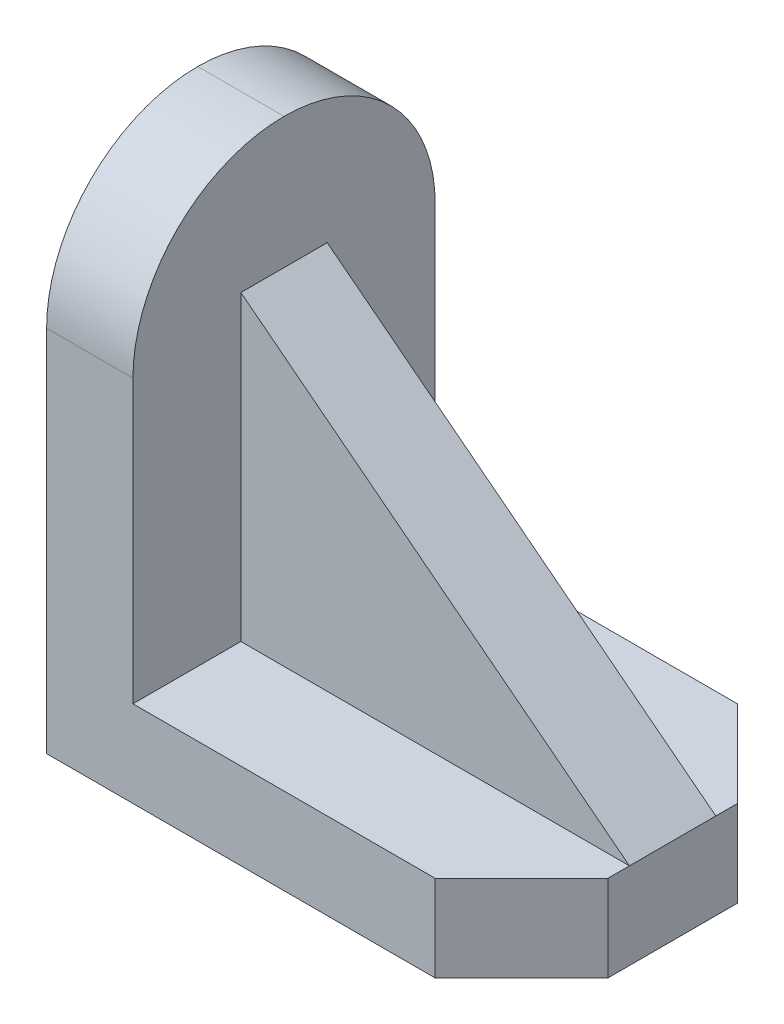
ISO-10303-21;
HEADER;
FILE_DESCRIPTION(('STEP AP214'),'2;1');
FILE_NAME('part.step','',(''),(''),'','','');
FILE_SCHEMA(('AUTOMOTIVE_DESIGN { 1 0 10303 214 1 1 1 1 }'));
ENDSEC;
DATA;
#1=APPLICATION_CONTEXT('core data for automotive mechanical design processes');
#2=APPLICATION_PROTOCOL_DEFINITION('international standard','automotive_design',2000,#1);
#3=PRODUCT_CONTEXT('',#1,'mechanical');
#4=PRODUCT('Part','Part','',(#3));
#5=PRODUCT_RELATED_PRODUCT_CATEGORY('part','',(#4));
#6=PRODUCT_DEFINITION_FORMATION('','',#4);
#7=PRODUCT_DEFINITION_CONTEXT('part definition',#1,'design');
#8=PRODUCT_DEFINITION('design','',#6,#7);
#9=PRODUCT_DEFINITION_SHAPE('','',#8);
#10=(LENGTH_UNIT() NAMED_UNIT(*) SI_UNIT(.MILLI.,.METRE.));
#11=(NAMED_UNIT(*) PLANE_ANGLE_UNIT() SI_UNIT($,.RADIAN.));
#12=(NAMED_UNIT(*) SI_UNIT($,.STERADIAN.) SOLID_ANGLE_UNIT());
#13=UNCERTAINTY_MEASURE_WITH_UNIT(LENGTH_MEASURE(1.E-05),#10,'distance_accuracy_value','');
#14=(GEOMETRIC_REPRESENTATION_CONTEXT(3) GLOBAL_UNCERTAINTY_ASSIGNED_CONTEXT((#13)) GLOBAL_UNIT_ASSIGNED_CONTEXT((#10,
#11,#12)) REPRESENTATION_CONTEXT('',''));
#15=CARTESIAN_POINT('',(0.,0.,0.));
#16=DIRECTION('',(0.,0.,1.));
#17=DIRECTION('',(1.,0.,0.));
#18=AXIS2_PLACEMENT_3D('',#15,#16,#17);
#19=CARTESIAN_POINT('',(0.,304.8,0.));
#20=DIRECTION('',(0.,1.,0.));
#21=DIRECTION('',(0.,0.,1.));
#22=AXIS2_PLACEMENT_3D('',#19,#20,#21);
#23=PLANE('',#22);
#24=DIRECTION('',(0.,0.,-1.));
#25=VECTOR('',#24,1.);
#26=CARTESIAN_POINT('',(-533.4,304.8,-533.4));
#27=LINE('',#26,#25);
#28=CARTESIAN_POINT('',(-533.4,304.8,-152.4));
#29=VERTEX_POINT('',#28);
#30=CARTESIAN_POINT('',(-533.4,304.8,-533.4));
#31=VERTEX_POINT('',#30);
#32=EDGE_CURVE('E164',#29,#31,#27,.T.);
#33=ORIENTED_EDGE('',*,*,#32,.F.);
#34=DIRECTION('',(-1.,0.,0.));
#35=VECTOR('',#34,1.);
#36=CARTESIAN_POINT('',(838.2,304.8,-152.4));
#37=LINE('',#36,#35);
#38=CARTESIAN_POINT('',(838.2,304.8,-152.4));
#39=VERTEX_POINT('',#38);
#40=EDGE_CURVE('E56',#39,#29,#37,.T.);
#41=ORIENTED_EDGE('',*,*,#40,.F.);
#42=DIRECTION('',(0.,0.,-1.));
#43=VECTOR('',#42,1.);
#44=CARTESIAN_POINT('',(838.2,304.8,228.6));
#45=LINE('',#44,#43);
#46=CARTESIAN_POINT('',(838.2,304.8,-228.599999999999));
#47=VERTEX_POINT('',#46);
#48=EDGE_CURVE('E179',#39,#47,#45,.T.);
#49=ORIENTED_EDGE('',*,*,#48,.T.);
#50=DIRECTION('',(0.707106781186546,0.,0.707106781186549));
#51=VECTOR('',#50,1.);
#52=CARTESIAN_POINT('',(533.400000000001,304.8,-533.399999999999));
#53=LINE('',#52,#51);
#54=CARTESIAN_POINT('',(533.4,304.8,-533.4));
#55=VERTEX_POINT('',#54);
#56=EDGE_CURVE('E228',#47,#55,#53,.F.);
#57=ORIENTED_EDGE('',*,*,#56,.T.);
#58=DIRECTION('',(-1.,0.,0.));
#59=VECTOR('',#58,1.);
#60=CARTESIAN_POINT('',(838.2,304.8,-533.4));
#61=LINE('',#60,#59);
#62=EDGE_CURVE('E183',#55,#31,#61,.T.);
#63=ORIENTED_EDGE('',*,*,#62,.T.);
#64=EDGE_LOOP('',(#33,#41,#49,#57,#63));
#65=FACE_BOUND('',#64,.T.);
#66=ADVANCED_FACE('F39',(#65),#23,.T.);
#67=CARTESIAN_POINT('',(-838.2,304.8,533.4));
#68=DIRECTION('',(1.,0.,0.));
#69=DIRECTION('',(0.,0.,-1.));
#70=AXIS2_PLACEMENT_3D('',#67,#68,#69);
#71=PLANE('',#70);
#72=CARTESIAN_POINT('',(-838.2,1300.48,1.35693925231964E-13));
#73=DIRECTION('',(1.,0.,0.));
#74=DIRECTION('',(0.,0.,-1.));
#75=AXIS2_PLACEMENT_3D('',#72,#73,#74);
#76=CIRCLE('',#75,533.4);
#77=CARTESIAN_POINT('',(-838.2,1300.48,533.4));
#78=VERTEX_POINT('',#77);
#79=CARTESIAN_POINT('',(-838.2,1833.88,1.11022302462516E-13));
#80=VERTEX_POINT('',#79);
#81=EDGE_CURVE('E231',#78,#80,#76,.F.);
#82=ORIENTED_EDGE('',*,*,#81,.T.);
#83=CARTESIAN_POINT('',(-838.2,1300.48,1.11022302462516E-13));
#84=DIRECTION('',(1.,0.,0.));
#85=DIRECTION('',(0.,0.,-1.));
#86=AXIS2_PLACEMENT_3D('',#83,#84,#85);
#87=CIRCLE('',#86,533.4);
#88=CARTESIAN_POINT('',(-838.2,1300.48,-533.4));
#89=VERTEX_POINT('',#88);
#90=EDGE_CURVE('E234',#80,#89,#87,.F.);
#91=ORIENTED_EDGE('',*,*,#90,.T.);
#92=DIRECTION('',(0.,-1.,0.));
#93=VECTOR('',#92,1.);
#94=CARTESIAN_POINT('',(-838.2,304.8,-533.4));
#95=LINE('',#94,#93);
#96=CARTESIAN_POINT('',(-838.2,0.,-533.4));
#97=VERTEX_POINT('',#96);
#98=EDGE_CURVE('E187',#89,#97,#95,.T.);
#99=ORIENTED_EDGE('',*,*,#98,.T.);
#100=DIRECTION('',(0.,0.,1.));
#101=VECTOR('',#100,1.);
#102=CARTESIAN_POINT('',(-838.2,0.,533.4));
#103=LINE('',#102,#101);
#104=CARTESIAN_POINT('',(-838.2,0.,533.4));
#105=VERTEX_POINT('',#104);
#106=EDGE_CURVE('E171',#97,#105,#103,.T.);
#107=ORIENTED_EDGE('',*,*,#106,.T.);
#108=DIRECTION('',(0.,-1.,0.));
#109=VECTOR('',#108,1.);
#110=CARTESIAN_POINT('',(-838.2,304.8,533.4));
#111=LINE('',#110,#109);
#112=EDGE_CURVE('E214',#78,#105,#111,.T.);
#113=ORIENTED_EDGE('',*,*,#112,.F.);
#114=EDGE_LOOP('',(#82,#91,#99,#107,#113));
#115=FACE_BOUND('',#114,.T.);
#116=ADVANCED_FACE('F277',(#115),#71,.F.);
#117=CARTESIAN_POINT('',(533.4,304.8,533.4));
#118=DIRECTION('',(0.,0.,-1.));
#119=DIRECTION('',(-1.,0.,0.));
#120=AXIS2_PLACEMENT_3D('',#117,#118,#119);
#121=PLANE('',#120);
#122=DIRECTION('',(0.,-1.,0.));
#123=VECTOR('',#122,1.);
#124=CARTESIAN_POINT('',(-533.4,1833.88,533.4));
#125=LINE('',#124,#123);
#126=CARTESIAN_POINT('',(-533.4,1300.48,533.4));
#127=VERTEX_POINT('',#126);
#128=CARTESIAN_POINT('',(-533.4,304.8,533.4));
#129=VERTEX_POINT('',#128);
#130=EDGE_CURVE('E168',#127,#129,#125,.T.);
#131=ORIENTED_EDGE('',*,*,#130,.F.);
#132=DIRECTION('',(1.,0.,0.));
#133=VECTOR('',#132,1.);
#134=CARTESIAN_POINT('',(-838.2,1300.48,533.4));
#135=LINE('',#134,#133);
#136=EDGE_CURVE('E11',#127,#78,#135,.F.);
#137=ORIENTED_EDGE('',*,*,#136,.T.);
#138=ORIENTED_EDGE('',*,*,#112,.T.);
#139=DIRECTION('',(1.,0.,0.));
#140=VECTOR('',#139,1.);
#141=CARTESIAN_POINT('',(533.4,0.,533.4));
#142=LINE('',#141,#140);
#143=CARTESIAN_POINT('',(533.4,0.,533.4));
#144=VERTEX_POINT('',#143);
#145=EDGE_CURVE('E191',#105,#144,#142,.T.);
#146=ORIENTED_EDGE('',*,*,#145,.T.);
#147=DIRECTION('',(0.,-1.,0.));
#148=VECTOR('',#147,1.);
#149=CARTESIAN_POINT('',(533.4,304.8,533.4));
#150=LINE('',#149,#148);
#151=CARTESIAN_POINT('',(533.4,304.8,533.4));
#152=VERTEX_POINT('',#151);
#153=EDGE_CURVE('E210',#152,#144,#150,.T.);
#154=ORIENTED_EDGE('',*,*,#153,.F.);
#155=DIRECTION('',(1.,0.,0.));
#156=VECTOR('',#155,1.);
#157=CARTESIAN_POINT('',(533.4,304.8,533.4));
#158=LINE('',#157,#156);
#159=EDGE_CURVE('E172',#129,#152,#158,.T.);
#160=ORIENTED_EDGE('',*,*,#159,.F.);
#161=EDGE_LOOP('',(#131,#137,#138,#146,#154,#160));
#162=FACE_BOUND('',#161,.T.);
#163=ADVANCED_FACE('F279',(#162),#121,.F.);
#164=CARTESIAN_POINT('',(838.2,304.8,228.6));
#165=DIRECTION('',(-0.707106781186548,0.,-0.707106781186547));
#166=DIRECTION('',(-0.707106781186547,0.,0.707106781186548));
#167=AXIS2_PLACEMENT_3D('',#164,#165,#166);
#168=PLANE('',#167);
#169=DIRECTION('',(0.707106781186547,0.,-0.707106781186547));
#170=VECTOR('',#169,1.);
#171=CARTESIAN_POINT('',(838.2,0.,228.6));
#172=LINE('',#171,#170);
#173=CARTESIAN_POINT('',(838.2,0.,228.6));
#174=VERTEX_POINT('',#173);
#175=EDGE_CURVE('E194',#144,#174,#172,.T.);
#176=ORIENTED_EDGE('',*,*,#175,.T.);
#177=DIRECTION('',(0.,-1.,0.));
#178=VECTOR('',#177,1.);
#179=CARTESIAN_POINT('',(838.2,304.8,228.6));
#180=LINE('',#179,#178);
#181=CARTESIAN_POINT('',(838.2,304.8,228.6));
#182=VERTEX_POINT('',#181);
#183=EDGE_CURVE('E206',#182,#174,#180,.T.);
#184=ORIENTED_EDGE('',*,*,#183,.F.);
#185=DIRECTION('',(0.707106781186547,0.,-0.707106781186547));
#186=VECTOR('',#185,1.);
#187=CARTESIAN_POINT('',(838.2,304.8,228.6));
#188=LINE('',#187,#186);
#189=EDGE_CURVE('E175',#152,#182,#188,.T.);
#190=ORIENTED_EDGE('',*,*,#189,.F.);
#191=ORIENTED_EDGE('',*,*,#153,.T.);
#192=EDGE_LOOP('',(#176,#184,#190,#191));
#193=FACE_BOUND('',#192,.T.);
#194=ADVANCED_FACE('F319',(#193),#168,.F.);
#195=CARTESIAN_POINT('',(838.2,304.8,228.6));
#196=DIRECTION('',(-1.,0.,0.));
#197=DIRECTION('',(0.,0.,1.));
#198=AXIS2_PLACEMENT_3D('',#195,#196,#197);
#199=PLANE('',#198);
#200=DIRECTION('',(0.,0.,-1.));
#201=VECTOR('',#200,1.);
#202=CARTESIAN_POINT('',(838.2,0.,228.6));
#203=LINE('',#202,#201);
#204=CARTESIAN_POINT('',(838.2,0.,-228.599999999999));
#205=VERTEX_POINT('',#204);
#206=EDGE_CURVE('E197',#174,#205,#203,.T.);
#207=ORIENTED_EDGE('',*,*,#206,.T.);
#208=DIRECTION('',(0.,1.,0.));
#209=VECTOR('',#208,1.);
#210=CARTESIAN_POINT('',(838.2,304.8,-228.599999999999));
#211=LINE('',#210,#209);
#212=EDGE_CURVE('E224',#205,#47,#211,.T.);
#213=ORIENTED_EDGE('',*,*,#212,.T.);
#214=ORIENTED_EDGE('',*,*,#48,.F.);
#215=DIRECTION('',(0.,0.,-1.));
#216=VECTOR('',#215,1.);
#217=CARTESIAN_POINT('',(838.2,304.8,152.4));
#218=LINE('',#217,#216);
#219=CARTESIAN_POINT('',(838.2,304.8,152.4));
#220=VERTEX_POINT('',#219);
#221=EDGE_CURVE('E63',#220,#39,#218,.T.);
#222=ORIENTED_EDGE('',*,*,#221,.F.);
#223=EDGE_CURVE('E180',#182,#220,#45,.T.);
#224=ORIENTED_EDGE('',*,*,#223,.F.);
#225=ORIENTED_EDGE('',*,*,#183,.T.);
#226=EDGE_LOOP('',(#207,#213,#214,#222,#224,#225));
#227=FACE_BOUND('',#226,.T.);
#228=ADVANCED_FACE('F314',(#227),#199,.F.);
#229=CARTESIAN_POINT('',(838.2,304.8,-533.4));
#230=DIRECTION('',(0.,0.,1.));
#231=DIRECTION('',(1.,0.,0.));
#232=AXIS2_PLACEMENT_3D('',#229,#230,#231);
#233=PLANE('',#232);
#234=ORIENTED_EDGE('',*,*,#98,.F.);
#235=DIRECTION('',(-1.,0.,0.));
#236=VECTOR('',#235,1.);
#237=CARTESIAN_POINT('',(-533.4,1300.48,-533.399999999999));
#238=LINE('',#237,#236);
#239=CARTESIAN_POINT('',(-533.4,1300.48,-533.4));
#240=VERTEX_POINT('',#239);
#241=EDGE_CURVE('E237',#89,#240,#238,.F.);
#242=ORIENTED_EDGE('',*,*,#241,.T.);
#243=DIRECTION('',(0.,-1.,0.));
#244=VECTOR('',#243,1.);
#245=CARTESIAN_POINT('',(-533.4,1833.88,-533.4));
#246=LINE('',#245,#244);
#247=EDGE_CURVE('E163',#240,#31,#246,.T.);
#248=ORIENTED_EDGE('',*,*,#247,.T.);
#249=ORIENTED_EDGE('',*,*,#62,.F.);
#250=DIRECTION('',(0.,-1.,0.));
#251=VECTOR('',#250,1.);
#252=CARTESIAN_POINT('',(533.4,304.8,-533.4));
#253=LINE('',#252,#251);
#254=CARTESIAN_POINT('',(533.4,0.,-533.4));
#255=VERTEX_POINT('',#254);
#256=EDGE_CURVE('E217',#55,#255,#253,.T.);
#257=ORIENTED_EDGE('',*,*,#256,.T.);
#258=DIRECTION('',(-1.,0.,0.));
#259=VECTOR('',#258,1.);
#260=CARTESIAN_POINT('',(838.2,0.,-533.4));
#261=LINE('',#260,#259);
#262=EDGE_CURVE('E176',#255,#97,#261,.T.);
#263=ORIENTED_EDGE('',*,*,#262,.T.);
#264=EDGE_LOOP('',(#234,#242,#248,#249,#257,#263));
#265=FACE_BOUND('',#264,.T.);
#266=ADVANCED_FACE('F262',(#265),#233,.F.);
#267=DIRECTION('',(-1.,0.,0.));
#268=VECTOR('',#267,1.);
#269=CARTESIAN_POINT('',(838.2,304.8,152.4));
#270=LINE('',#269,#268);
#271=CARTESIAN_POINT('',(-533.4,304.8,152.4));
#272=VERTEX_POINT('',#271);
#273=EDGE_CURVE('E142',#220,#272,#270,.T.);
#274=ORIENTED_EDGE('',*,*,#273,.T.);
#275=EDGE_CURVE('E160',#129,#272,#27,.T.);
#276=ORIENTED_EDGE('',*,*,#275,.F.);
#277=ORIENTED_EDGE('',*,*,#159,.T.);
#278=ORIENTED_EDGE('',*,*,#189,.T.);
#279=ORIENTED_EDGE('',*,*,#223,.T.);
#280=EDGE_LOOP('',(#274,#276,#277,#278,#279));
#281=FACE_BOUND('',#280,.T.);
#282=ADVANCED_FACE('F284',(#281),#23,.T.);
#283=CARTESIAN_POINT('',(0.,0.,0.));
#284=DIRECTION('',(0.,1.,0.));
#285=DIRECTION('',(0.,0.,1.));
#286=AXIS2_PLACEMENT_3D('',#283,#284,#285);
#287=PLANE('',#286);
#288=ORIENTED_EDGE('',*,*,#262,.F.);
#289=DIRECTION('',(-0.707106781186546,0.,-0.707106781186549));
#290=VECTOR('',#289,1.);
#291=CARTESIAN_POINT('',(533.4,0.,-533.4));
#292=LINE('',#291,#290);
#293=EDGE_CURVE('E221',#255,#205,#292,.F.);
#294=ORIENTED_EDGE('',*,*,#293,.T.);
#295=ORIENTED_EDGE('',*,*,#206,.F.);
#296=ORIENTED_EDGE('',*,*,#175,.F.);
#297=ORIENTED_EDGE('',*,*,#145,.F.);
#298=ORIENTED_EDGE('',*,*,#106,.F.);
#299=EDGE_LOOP('',(#288,#294,#295,#296,#297,#298));
#300=FACE_BOUND('',#299,.T.);
#301=ADVANCED_FACE('F271',(#300),#287,.F.);
#302=CARTESIAN_POINT('',(533.4,304.8,-533.4));
#303=DIRECTION('',(-0.707106781186549,0.,0.707106781186546));
#304=DIRECTION('',(0.,-1.,0.));
#305=AXIS2_PLACEMENT_3D('',#302,#303,#304);
#306=PLANE('',#305);
#307=ORIENTED_EDGE('',*,*,#56,.F.);
#308=ORIENTED_EDGE('',*,*,#212,.F.);
#309=ORIENTED_EDGE('',*,*,#293,.F.);
#310=ORIENTED_EDGE('',*,*,#256,.F.);
#311=EDGE_LOOP('',(#307,#308,#309,#310));
#312=FACE_BOUND('',#311,.T.);
#313=ADVANCED_FACE('F267',(#312),#306,.F.);
#314=CARTESIAN_POINT('',(-533.4,1833.88,-533.4));
#315=DIRECTION('',(-1.,0.,0.));
#316=DIRECTION('',(0.,0.,1.));
#317=AXIS2_PLACEMENT_3D('',#314,#315,#316);
#318=PLANE('',#317);
#319=ORIENTED_EDGE('',*,*,#275,.T.);
#320=DIRECTION('',(0.,1.,0.));
#321=VECTOR('',#320,1.);
#322=CARTESIAN_POINT('',(-533.4,304.8,152.4));
#323=LINE('',#322,#321);
#324=CARTESIAN_POINT('',(-533.4,1371.6,152.4));
#325=VERTEX_POINT('',#324);
#326=EDGE_CURVE('E137',#272,#325,#323,.T.);
#327=ORIENTED_EDGE('',*,*,#326,.T.);
#328=DIRECTION('',(0.,0.,-1.));
#329=VECTOR('',#328,1.);
#330=CARTESIAN_POINT('',(-533.4,1371.6,152.4));
#331=LINE('',#330,#329);
#332=CARTESIAN_POINT('',(-533.4,1371.6,-152.4));
#333=VERTEX_POINT('',#332);
#334=EDGE_CURVE('E130',#325,#333,#331,.T.);
#335=ORIENTED_EDGE('',*,*,#334,.T.);
#336=DIRECTION('',(0.,1.,0.));
#337=VECTOR('',#336,1.);
#338=CARTESIAN_POINT('',(-533.4,304.8,-152.4));
#339=LINE('',#338,#337);
#340=EDGE_CURVE('E135',#29,#333,#339,.T.);
#341=ORIENTED_EDGE('',*,*,#340,.F.);
#342=ORIENTED_EDGE('',*,*,#32,.T.);
#343=ORIENTED_EDGE('',*,*,#247,.F.);
#344=CARTESIAN_POINT('',(-533.4,1300.48,0.));
#345=DIRECTION('',(-1.,0.,0.));
#346=DIRECTION('',(0.,0.,1.));
#347=AXIS2_PLACEMENT_3D('',#344,#345,#346);
#348=CIRCLE('',#347,533.4);
#349=CARTESIAN_POINT('',(-533.4,1833.88,1.11022302462516E-13));
#350=VERTEX_POINT('',#349);
#351=EDGE_CURVE('E49',#240,#350,#348,.F.);
#352=ORIENTED_EDGE('',*,*,#351,.T.);
#353=CARTESIAN_POINT('',(-533.4,1300.48,0.));
#354=DIRECTION('',(-1.,0.,0.));
#355=DIRECTION('',(0.,0.,1.));
#356=AXIS2_PLACEMENT_3D('',#353,#354,#355);
#357=CIRCLE('',#356,533.4);
#358=EDGE_CURVE('E241',#350,#127,#357,.F.);
#359=ORIENTED_EDGE('',*,*,#358,.T.);
#360=ORIENTED_EDGE('',*,*,#130,.T.);
#361=EDGE_LOOP('',(#319,#327,#335,#341,#342,#343,#352,#359,#360));
#362=FACE_BOUND('',#361,.T.);
#363=ADVANCED_FACE('F133',(#362),#318,.F.);
#364=CARTESIAN_POINT('',(0.,1300.48,0.));
#365=DIRECTION('',(-1.,0.,0.));
#366=DIRECTION('',(0.,0.,1.));
#367=AXIS2_PLACEMENT_3D('',#364,#365,#366);
#368=CYLINDRICAL_SURFACE('',#367,533.4);
#369=ORIENTED_EDGE('',*,*,#136,.F.);
#370=ORIENTED_EDGE('',*,*,#358,.F.);
#371=DIRECTION('',(1.,0.,0.));
#372=VECTOR('',#371,1.);
#373=CARTESIAN_POINT('',(-533.4,1833.88,0.));
#374=LINE('',#373,#372);
#375=EDGE_CURVE('E43',#80,#350,#374,.T.);
#376=ORIENTED_EDGE('',*,*,#375,.F.);
#377=ORIENTED_EDGE('',*,*,#81,.F.);
#378=EDGE_LOOP('',(#369,#370,#376,#377));
#379=FACE_BOUND('',#378,.T.);
#380=ADVANCED_FACE('F41',(#379),#368,.T.);
#381=CARTESIAN_POINT('',(0.,1300.48,0.));
#382=DIRECTION('',(1.,0.,0.));
#383=DIRECTION('',(0.,0.,-1.));
#384=AXIS2_PLACEMENT_3D('',#381,#382,#383);
#385=CYLINDRICAL_SURFACE('',#384,533.4);
#386=ORIENTED_EDGE('',*,*,#351,.F.);
#387=ORIENTED_EDGE('',*,*,#241,.F.);
#388=ORIENTED_EDGE('',*,*,#90,.F.);
#389=ORIENTED_EDGE('',*,*,#375,.T.);
#390=EDGE_LOOP('',(#386,#387,#388,#389));
#391=FACE_BOUND('',#390,.T.);
#392=ADVANCED_FACE('F256',(#391),#385,.T.);
#393=CARTESIAN_POINT('',(-533.4,1371.6,152.4));
#394=DIRECTION('',(0.613940613514921,0.789352217376326,0.));
#395=DIRECTION('',(-0.789352217376326,0.613940613514921,0.));
#396=AXIS2_PLACEMENT_3D('',#393,#394,#395);
#397=PLANE('',#396);
#398=DIRECTION('',(0.789352217376326,-0.61394061351492,0.));
#399=VECTOR('',#398,1.);
#400=CARTESIAN_POINT('',(-533.4,1371.6,-152.4));
#401=LINE('',#400,#399);
#402=EDGE_CURVE('E145',#333,#39,#401,.T.);
#403=ORIENTED_EDGE('',*,*,#402,.F.);
#404=ORIENTED_EDGE('',*,*,#334,.F.);
#405=DIRECTION('',(0.789352217376326,-0.61394061351492,0.));
#406=VECTOR('',#405,1.);
#407=CARTESIAN_POINT('',(-533.4,1371.6,152.4));
#408=LINE('',#407,#406);
#409=EDGE_CURVE('E288',#325,#220,#408,.T.);
#410=ORIENTED_EDGE('',*,*,#409,.T.);
#411=ORIENTED_EDGE('',*,*,#221,.T.);
#412=EDGE_LOOP('',(#403,#404,#410,#411));
#413=FACE_BOUND('',#412,.T.);
#414=ADVANCED_FACE('F146',(#413),#397,.T.);
#415=CARTESIAN_POINT('',(0.,0.,152.4));
#416=DIRECTION('',(0.,0.,1.));
#417=DIRECTION('',(1.,0.,0.));
#418=AXIS2_PLACEMENT_3D('',#415,#416,#417);
#419=PLANE('',#418);
#420=ORIENTED_EDGE('',*,*,#326,.F.);
#421=ORIENTED_EDGE('',*,*,#273,.F.);
#422=ORIENTED_EDGE('',*,*,#409,.F.);
#423=EDGE_LOOP('',(#420,#421,#422));
#424=FACE_BOUND('',#423,.T.);
#425=ADVANCED_FACE('F292',(#424),#419,.T.);
#426=CARTESIAN_POINT('',(0.,0.,-152.4));
#427=DIRECTION('',(0.,0.,1.));
#428=DIRECTION('',(1.,0.,0.));
#429=AXIS2_PLACEMENT_3D('',#426,#427,#428);
#430=PLANE('',#429);
#431=ORIENTED_EDGE('',*,*,#340,.T.);
#432=ORIENTED_EDGE('',*,*,#402,.T.);
#433=ORIENTED_EDGE('',*,*,#40,.T.);
#434=EDGE_LOOP('',(#431,#432,#433));
#435=FACE_BOUND('',#434,.T.);
#436=ADVANCED_FACE('F150',(#435),#430,.F.);
#437=CLOSED_SHELL('',(#66,#116,#163,#194,#228,#266,#282,#301,#313,#363,#380,#392,#414,#425,#436));
#438=MANIFOLD_SOLID_BREP('B2',#437);
#439=ADVANCED_BREP_SHAPE_REPRESENTATION('',(#18,#438),#14);
#440=SHAPE_DEFINITION_REPRESENTATION(#9,#439);
ENDSEC;
END-ISO-10303-21;
